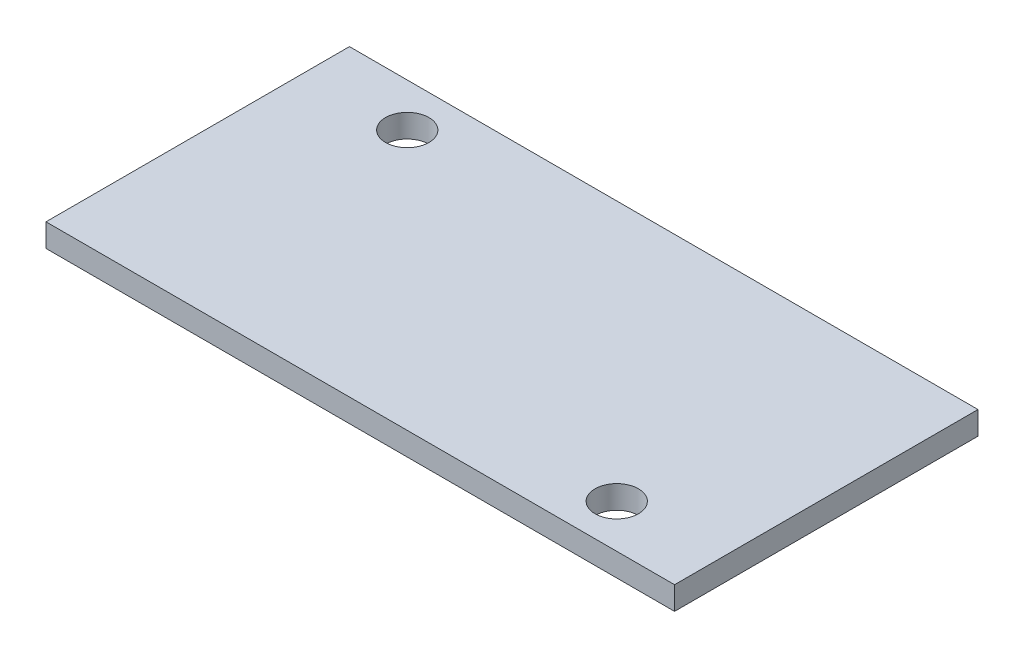
ISO-10303-21;
HEADER;
FILE_DESCRIPTION(('STEP AP214'),'2;1');
FILE_NAME('part.step','',(''),(''),'','','');
FILE_SCHEMA(('AUTOMOTIVE_DESIGN { 1 0 10303 214 1 1 1 1 }'));
ENDSEC;
DATA;
#1=APPLICATION_CONTEXT('core data for automotive mechanical design processes');
#2=APPLICATION_PROTOCOL_DEFINITION('international standard','automotive_design',2000,#1);
#3=PRODUCT_CONTEXT('',#1,'mechanical');
#4=PRODUCT('Part','Part','',(#3));
#5=PRODUCT_RELATED_PRODUCT_CATEGORY('part','',(#4));
#6=PRODUCT_DEFINITION_FORMATION('','',#4);
#7=PRODUCT_DEFINITION_CONTEXT('part definition',#1,'design');
#8=PRODUCT_DEFINITION('design','',#6,#7);
#9=PRODUCT_DEFINITION_SHAPE('','',#8);
#10=(LENGTH_UNIT() NAMED_UNIT(*) SI_UNIT(.MILLI.,.METRE.));
#11=(NAMED_UNIT(*) PLANE_ANGLE_UNIT() SI_UNIT($,.RADIAN.));
#12=(NAMED_UNIT(*) SI_UNIT($,.STERADIAN.) SOLID_ANGLE_UNIT());
#13=UNCERTAINTY_MEASURE_WITH_UNIT(LENGTH_MEASURE(1.E-05),#10,'distance_accuracy_value','');
#14=(GEOMETRIC_REPRESENTATION_CONTEXT(3) GLOBAL_UNCERTAINTY_ASSIGNED_CONTEXT((#13)) GLOBAL_UNIT_ASSIGNED_CONTEXT((#10,
#11,#12)) REPRESENTATION_CONTEXT('',''));
#15=CARTESIAN_POINT('',(0.,0.,0.));
#16=DIRECTION('',(0.,0.,1.));
#17=DIRECTION('',(1.,0.,0.));
#18=AXIS2_PLACEMENT_3D('',#15,#16,#17);
#19=CARTESIAN_POINT('',(-21.75,1.6,-10.5));
#20=DIRECTION('',(1.,0.,0.));
#21=DIRECTION('',(0.,0.,-1.));
#22=AXIS2_PLACEMENT_3D('',#19,#20,#21);
#23=PLANE('',#22);
#24=DIRECTION('',(0.,0.,1.));
#25=VECTOR('',#24,1.);
#26=CARTESIAN_POINT('',(-21.75,0.,-10.5));
#27=LINE('',#26,#25);
#28=CARTESIAN_POINT('',(-21.75,0.,-10.5));
#29=VERTEX_POINT('',#28);
#30=CARTESIAN_POINT('',(-21.75,0.,10.5));
#31=VERTEX_POINT('',#30);
#32=EDGE_CURVE('E101',#29,#31,#27,.T.);
#33=ORIENTED_EDGE('',*,*,#32,.T.);
#34=DIRECTION('',(0.,-1.,0.));
#35=VECTOR('',#34,1.);
#36=CARTESIAN_POINT('',(-21.75,1.6,10.5));
#37=LINE('',#36,#35);
#38=CARTESIAN_POINT('',(-21.75,1.6,10.5));
#39=VERTEX_POINT('',#38);
#40=EDGE_CURVE('E11',#39,#31,#37,.T.);
#41=ORIENTED_EDGE('',*,*,#40,.F.);
#42=DIRECTION('',(0.,0.,1.));
#43=VECTOR('',#42,1.);
#44=CARTESIAN_POINT('',(-21.75,1.6,-10.5));
#45=LINE('',#44,#43);
#46=CARTESIAN_POINT('',(-21.75,1.6,-10.5));
#47=VERTEX_POINT('',#46);
#48=EDGE_CURVE('E88',#47,#39,#45,.T.);
#49=ORIENTED_EDGE('',*,*,#48,.F.);
#50=DIRECTION('',(0.,-1.,0.));
#51=VECTOR('',#50,1.);
#52=CARTESIAN_POINT('',(-21.75,1.6,-10.5));
#53=LINE('',#52,#51);
#54=EDGE_CURVE('E97',#47,#29,#53,.T.);
#55=ORIENTED_EDGE('',*,*,#54,.T.);
#56=EDGE_LOOP('',(#33,#41,#49,#55));
#57=FACE_BOUND('',#56,.T.);
#58=ADVANCED_FACE('F35',(#57),#23,.F.);
#59=CARTESIAN_POINT('',(-21.75,1.6,10.5));
#60=DIRECTION('',(0.,0.,-1.));
#61=DIRECTION('',(-1.,0.,0.));
#62=AXIS2_PLACEMENT_3D('',#59,#60,#61);
#63=PLANE('',#62);
#64=DIRECTION('',(1.,0.,0.));
#65=VECTOR('',#64,1.);
#66=CARTESIAN_POINT('',(-21.75,0.,10.5));
#67=LINE('',#66,#65);
#68=CARTESIAN_POINT('',(21.75,0.,10.5));
#69=VERTEX_POINT('',#68);
#70=EDGE_CURVE('E92',#31,#69,#67,.T.);
#71=ORIENTED_EDGE('',*,*,#70,.T.);
#72=DIRECTION('',(0.,-1.,0.));
#73=VECTOR('',#72,1.);
#74=CARTESIAN_POINT('',(21.75,1.6,10.5));
#75=LINE('',#74,#73);
#76=CARTESIAN_POINT('',(21.75,1.6,10.5));
#77=VERTEX_POINT('',#76);
#78=EDGE_CURVE('E44',#77,#69,#75,.T.);
#79=ORIENTED_EDGE('',*,*,#78,.F.);
#80=DIRECTION('',(1.,0.,0.));
#81=VECTOR('',#80,1.);
#82=CARTESIAN_POINT('',(-21.75,1.6,10.5));
#83=LINE('',#82,#81);
#84=EDGE_CURVE('E83',#39,#77,#83,.T.);
#85=ORIENTED_EDGE('',*,*,#84,.F.);
#86=ORIENTED_EDGE('',*,*,#40,.T.);
#87=EDGE_LOOP('',(#71,#79,#85,#86));
#88=FACE_BOUND('',#87,.T.);
#89=ADVANCED_FACE('F91',(#88),#63,.F.);
#90=CARTESIAN_POINT('',(21.75,1.6,-10.5));
#91=DIRECTION('',(-1.,0.,0.));
#92=DIRECTION('',(0.,0.,1.));
#93=AXIS2_PLACEMENT_3D('',#90,#91,#92);
#94=PLANE('',#93);
#95=DIRECTION('',(0.,0.,-1.));
#96=VECTOR('',#95,1.);
#97=CARTESIAN_POINT('',(21.75,0.,-10.5));
#98=LINE('',#97,#96);
#99=CARTESIAN_POINT('',(21.75,0.,-10.5));
#100=VERTEX_POINT('',#99);
#101=EDGE_CURVE('E70',#69,#100,#98,.T.);
#102=ORIENTED_EDGE('',*,*,#101,.T.);
#103=DIRECTION('',(0.,-1.,0.));
#104=VECTOR('',#103,1.);
#105=CARTESIAN_POINT('',(21.75,1.6,-10.5));
#106=LINE('',#105,#104);
#107=CARTESIAN_POINT('',(21.75,1.6,-10.5));
#108=VERTEX_POINT('',#107);
#109=EDGE_CURVE('E93',#108,#100,#106,.T.);
#110=ORIENTED_EDGE('',*,*,#109,.F.);
#111=DIRECTION('',(0.,0.,-1.));
#112=VECTOR('',#111,1.);
#113=CARTESIAN_POINT('',(21.75,1.6,-10.5));
#114=LINE('',#113,#112);
#115=EDGE_CURVE('E86',#77,#108,#114,.T.);
#116=ORIENTED_EDGE('',*,*,#115,.F.);
#117=ORIENTED_EDGE('',*,*,#78,.T.);
#118=EDGE_LOOP('',(#102,#110,#116,#117));
#119=FACE_BOUND('',#118,.T.);
#120=ADVANCED_FACE('F95',(#119),#94,.F.);
#121=CARTESIAN_POINT('',(-21.75,1.6,-10.5));
#122=DIRECTION('',(0.,0.,1.));
#123=DIRECTION('',(1.,0.,0.));
#124=AXIS2_PLACEMENT_3D('',#121,#122,#123);
#125=PLANE('',#124);
#126=DIRECTION('',(-1.,0.,0.));
#127=VECTOR('',#126,1.);
#128=CARTESIAN_POINT('',(-21.75,0.,-10.5));
#129=LINE('',#128,#127);
#130=EDGE_CURVE('E76',#100,#29,#129,.T.);
#131=ORIENTED_EDGE('',*,*,#130,.T.);
#132=ORIENTED_EDGE('',*,*,#54,.F.);
#133=DIRECTION('',(-1.,0.,0.));
#134=VECTOR('',#133,1.);
#135=CARTESIAN_POINT('',(-21.75,1.6,-10.5));
#136=LINE('',#135,#134);
#137=EDGE_CURVE('E53',#108,#47,#136,.T.);
#138=ORIENTED_EDGE('',*,*,#137,.F.);
#139=ORIENTED_EDGE('',*,*,#109,.T.);
#140=EDGE_LOOP('',(#131,#132,#138,#139));
#141=FACE_BOUND('',#140,.T.);
#142=ADVANCED_FACE('F129',(#141),#125,.F.);
#143=CARTESIAN_POINT('',(0.,1.6,0.));
#144=DIRECTION('',(0.,1.,0.));
#145=DIRECTION('',(0.,0.,1.));
#146=AXIS2_PLACEMENT_3D('',#143,#144,#145);
#147=PLANE('',#146);
#148=CARTESIAN_POINT('',(14.75,1.6,7.5));
#149=DIRECTION('',(0.,1.,0.));
#150=DIRECTION('',(0.,0.,1.));
#151=AXIS2_PLACEMENT_3D('',#148,#149,#150);
#152=CIRCLE('',#151,1.5);
#153=CARTESIAN_POINT('',(14.75,1.6,9.));
#154=VERTEX_POINT('',#153);
#155=EDGE_CURVE('E118',#154,#154,#152,.T.);
#156=ORIENTED_EDGE('',*,*,#155,.F.);
#157=EDGE_LOOP('',(#156));
#158=FACE_BOUND('',#157,.T.);
#159=CARTESIAN_POINT('',(-14.75,1.6,-7.5));
#160=DIRECTION('',(0.,1.,0.));
#161=DIRECTION('',(0.,0.,1.));
#162=AXIS2_PLACEMENT_3D('',#159,#160,#161);
#163=CIRCLE('',#162,1.5);
#164=CARTESIAN_POINT('',(-14.75,1.6,-6.));
#165=VERTEX_POINT('',#164);
#166=EDGE_CURVE('E110',#165,#165,#163,.T.);
#167=ORIENTED_EDGE('',*,*,#166,.F.);
#168=EDGE_LOOP('',(#167));
#169=FACE_BOUND('',#168,.T.);
#170=ORIENTED_EDGE('',*,*,#48,.T.);
#171=ORIENTED_EDGE('',*,*,#84,.T.);
#172=ORIENTED_EDGE('',*,*,#115,.T.);
#173=ORIENTED_EDGE('',*,*,#137,.T.);
#174=EDGE_LOOP('',(#170,#171,#172,#173));
#175=FACE_BOUND('',#174,.T.);
#176=ADVANCED_FACE('F84',(#158,#169,#175),#147,.T.);
#177=CARTESIAN_POINT('',(0.,0.,0.));
#178=DIRECTION('',(0.,1.,0.));
#179=DIRECTION('',(0.,0.,1.));
#180=AXIS2_PLACEMENT_3D('',#177,#178,#179);
#181=PLANE('',#180);
#182=CARTESIAN_POINT('',(14.75,0.,7.5));
#183=DIRECTION('',(0.,1.,0.));
#184=DIRECTION('',(0.,0.,1.));
#185=AXIS2_PLACEMENT_3D('',#182,#183,#184);
#186=CIRCLE('',#185,1.5);
#187=CARTESIAN_POINT('',(14.75,0.,9.));
#188=VERTEX_POINT('',#187);
#189=EDGE_CURVE('E38',#188,#188,#186,.T.);
#190=ORIENTED_EDGE('',*,*,#189,.T.);
#191=EDGE_LOOP('',(#190));
#192=FACE_BOUND('',#191,.T.);
#193=CARTESIAN_POINT('',(-14.75,0.,-7.5));
#194=DIRECTION('',(0.,1.,0.));
#195=DIRECTION('',(0.,0.,1.));
#196=AXIS2_PLACEMENT_3D('',#193,#194,#195);
#197=CIRCLE('',#196,1.5);
#198=CARTESIAN_POINT('',(-14.75,0.,-6.));
#199=VERTEX_POINT('',#198);
#200=EDGE_CURVE('E104',#199,#199,#197,.T.);
#201=ORIENTED_EDGE('',*,*,#200,.T.);
#202=EDGE_LOOP('',(#201));
#203=FACE_BOUND('',#202,.T.);
#204=ORIENTED_EDGE('',*,*,#32,.F.);
#205=ORIENTED_EDGE('',*,*,#130,.F.);
#206=ORIENTED_EDGE('',*,*,#101,.F.);
#207=ORIENTED_EDGE('',*,*,#70,.F.);
#208=EDGE_LOOP('',(#204,#205,#206,#207));
#209=FACE_BOUND('',#208,.T.);
#210=ADVANCED_FACE('F128',(#192,#203,#209),#181,.F.);
#211=CARTESIAN_POINT('',(-14.75,-8.4,-7.5));
#212=DIRECTION('',(0.,1.,0.));
#213=DIRECTION('',(0.,0.,1.));
#214=AXIS2_PLACEMENT_3D('',#211,#212,#213);
#215=CYLINDRICAL_SURFACE('',#214,1.5);
#216=ORIENTED_EDGE('',*,*,#166,.T.);
#217=EDGE_LOOP('',(#216));
#218=FACE_BOUND('',#217,.T.);
#219=ORIENTED_EDGE('',*,*,#200,.F.);
#220=EDGE_LOOP('',(#219));
#221=FACE_BOUND('',#220,.T.);
#222=ADVANCED_FACE('F135',(#218,#221),#215,.F.);
#223=CARTESIAN_POINT('',(14.75,-8.4,7.5));
#224=DIRECTION('',(0.,1.,0.));
#225=DIRECTION('',(0.,0.,1.));
#226=AXIS2_PLACEMENT_3D('',#223,#224,#225);
#227=CYLINDRICAL_SURFACE('',#226,1.5);
#228=ORIENTED_EDGE('',*,*,#155,.T.);
#229=EDGE_LOOP('',(#228));
#230=FACE_BOUND('',#229,.T.);
#231=ORIENTED_EDGE('',*,*,#189,.F.);
#232=EDGE_LOOP('',(#231));
#233=FACE_BOUND('',#232,.T.);
#234=ADVANCED_FACE('F123',(#230,#233),#227,.F.);
#235=CLOSED_SHELL('',(#58,#89,#120,#142,#176,#210,#222,#234));
#236=MANIFOLD_SOLID_BREP('B2',#235);
#237=ADVANCED_BREP_SHAPE_REPRESENTATION('',(#18,#236),#14);
#238=SHAPE_DEFINITION_REPRESENTATION(#9,#237);
ENDSEC;
END-ISO-10303-21;
